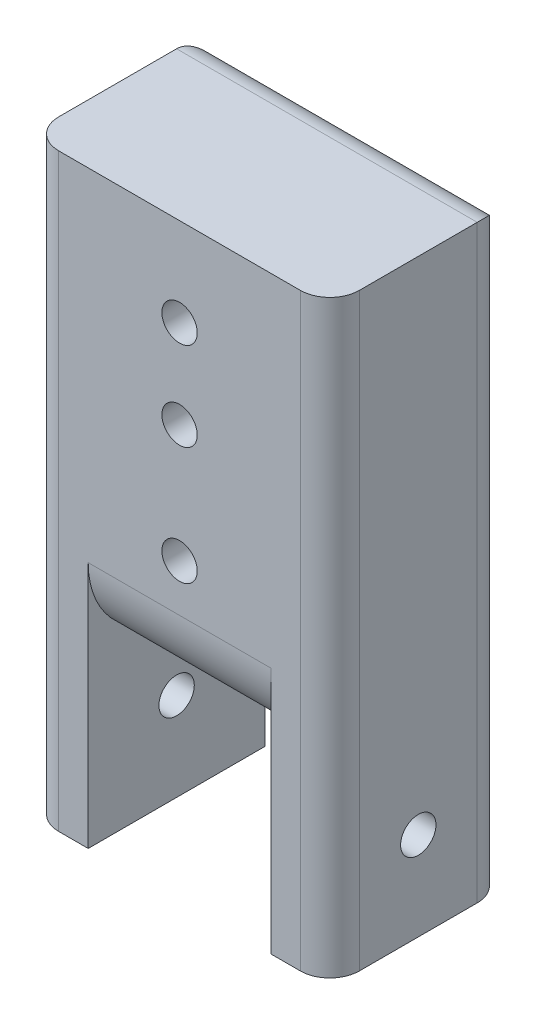
ISO-10303-21;
HEADER;
FILE_DESCRIPTION(('STEP AP214'),'2;1');
FILE_NAME('part.step','',(''),(''),'','','');
FILE_SCHEMA(('AUTOMOTIVE_DESIGN { 1 0 10303 214 1 1 1 1 }'));
ENDSEC;
DATA;
#1=APPLICATION_CONTEXT('core data for automotive mechanical design processes');
#2=APPLICATION_PROTOCOL_DEFINITION('international standard','automotive_design',2000,#1);
#3=PRODUCT_CONTEXT('',#1,'mechanical');
#4=PRODUCT('Part','Part','',(#3));
#5=PRODUCT_RELATED_PRODUCT_CATEGORY('part','',(#4));
#6=PRODUCT_DEFINITION_FORMATION('','',#4);
#7=PRODUCT_DEFINITION_CONTEXT('part definition',#1,'design');
#8=PRODUCT_DEFINITION('design','',#6,#7);
#9=PRODUCT_DEFINITION_SHAPE('','',#8);
#10=(LENGTH_UNIT() NAMED_UNIT(*) SI_UNIT(.MILLI.,.METRE.));
#11=(NAMED_UNIT(*) PLANE_ANGLE_UNIT() SI_UNIT($,.RADIAN.));
#12=(NAMED_UNIT(*) SI_UNIT($,.STERADIAN.) SOLID_ANGLE_UNIT());
#13=UNCERTAINTY_MEASURE_WITH_UNIT(LENGTH_MEASURE(1.E-05),#10,'distance_accuracy_value','');
#14=(GEOMETRIC_REPRESENTATION_CONTEXT(3) GLOBAL_UNCERTAINTY_ASSIGNED_CONTEXT((#13)) GLOBAL_UNIT_ASSIGNED_CONTEXT((#10,
#11,#12)) REPRESENTATION_CONTEXT('',''));
#15=CARTESIAN_POINT('',(0.,0.,0.));
#16=DIRECTION('',(0.,0.,1.));
#17=DIRECTION('',(1.,0.,0.));
#18=AXIS2_PLACEMENT_3D('',#15,#16,#17);
#19=CARTESIAN_POINT('',(0.,0.,30.));
#20=DIRECTION('',(1.,0.,0.));
#21=DIRECTION('',(0.,1.,0.));
#22=AXIS2_PLACEMENT_3D('',#19,#20,#21);
#23=PLANE('',#22);
#24=CARTESIAN_POINT('',(0.,-85.,15.));
#25=DIRECTION('',(1.,0.,0.));
#26=DIRECTION('',(0.,1.,0.));
#27=AXIS2_PLACEMENT_3D('',#24,#25,#26);
#28=CIRCLE('',#27,3.);
#29=CARTESIAN_POINT('',(0.,-82.,15.));
#30=VERTEX_POINT('',#29);
#31=EDGE_CURVE('E169',#30,#30,#28,.T.);
#32=ORIENTED_EDGE('',*,*,#31,.T.);
#33=EDGE_LOOP('',(#32));
#34=FACE_BOUND('',#33,.T.);
#35=DIRECTION('',(0.,0.,-1.));
#36=VECTOR('',#35,1.);
#37=CARTESIAN_POINT('',(0.,-100.,30.));
#38=LINE('',#37,#36);
#39=CARTESIAN_POINT('',(0.,-100.,25.));
#40=VERTEX_POINT('',#39);
#41=CARTESIAN_POINT('',(0.,-100.,5.));
#42=VERTEX_POINT('',#41);
#43=EDGE_CURVE('E149',#40,#42,#38,.T.);
#44=ORIENTED_EDGE('',*,*,#43,.F.);
#45=DIRECTION('',(0.,-1.,0.));
#46=VECTOR('',#45,1.);
#47=CARTESIAN_POINT('',(0.,0.,25.));
#48=LINE('',#47,#46);
#49=CARTESIAN_POINT('',(0.,0.,25.));
#50=VERTEX_POINT('',#49);
#51=EDGE_CURVE('E216',#40,#50,#48,.F.);
#52=ORIENTED_EDGE('',*,*,#51,.T.);
#53=DIRECTION('',(0.,0.,-1.));
#54=VECTOR('',#53,1.);
#55=CARTESIAN_POINT('',(0.,0.,30.));
#56=LINE('',#55,#54);
#57=CARTESIAN_POINT('',(0.,0.,5.));
#58=VERTEX_POINT('',#57);
#59=EDGE_CURVE('E166',#50,#58,#56,.T.);
#60=ORIENTED_EDGE('',*,*,#59,.T.);
#61=DIRECTION('',(0.,-1.,0.));
#62=VECTOR('',#61,1.);
#63=CARTESIAN_POINT('',(0.,0.,5.));
#64=LINE('',#63,#62);
#65=EDGE_CURVE('E192',#58,#42,#64,.T.);
#66=ORIENTED_EDGE('',*,*,#65,.T.);
#67=EDGE_LOOP('',(#44,#52,#60,#66));
#68=FACE_BOUND('',#67,.T.);
#69=ADVANCED_FACE('F35',(#34,#68),#23,.F.);
#70=CARTESIAN_POINT('',(0.,-100.,30.));
#71=DIRECTION('',(0.,1.,0.));
#72=DIRECTION('',(0.,0.,1.));
#73=AXIS2_PLACEMENT_3D('',#70,#71,#72);
#74=PLANE('',#73);
#75=DIRECTION('',(1.,0.,0.));
#76=VECTOR('',#75,1.);
#77=CARTESIAN_POINT('',(0.,-100.,30.));
#78=LINE('',#77,#76);
#79=CARTESIAN_POINT('',(5.00000000000001,-100.,30.));
#80=VERTEX_POINT('',#79);
#81=CARTESIAN_POINT('',(10.,-100.,30.));
#82=VERTEX_POINT('',#81);
#83=EDGE_CURVE('E131',#80,#82,#78,.T.);
#84=ORIENTED_EDGE('',*,*,#83,.F.);
#85=CARTESIAN_POINT('',(5.00000000000001,-100.,25.));
#86=DIRECTION('',(0.,1.,0.));
#87=DIRECTION('',(0.,0.,1.));
#88=AXIS2_PLACEMENT_3D('',#85,#86,#87);
#89=CIRCLE('',#88,5.);
#90=EDGE_CURVE('E214',#80,#40,#89,.F.);
#91=ORIENTED_EDGE('',*,*,#90,.T.);
#92=ORIENTED_EDGE('',*,*,#43,.T.);
#93=CARTESIAN_POINT('',(5.00000000000001,-100.,5.));
#94=DIRECTION('',(0.,1.,0.));
#95=DIRECTION('',(0.,0.,1.));
#96=AXIS2_PLACEMENT_3D('',#93,#94,#95);
#97=CIRCLE('',#96,5.);
#98=CARTESIAN_POINT('',(5.00000000000001,-100.,0.));
#99=VERTEX_POINT('',#98);
#100=EDGE_CURVE('E195',#42,#99,#97,.F.);
#101=ORIENTED_EDGE('',*,*,#100,.T.);
#102=DIRECTION('',(1.,0.,0.));
#103=VECTOR('',#102,1.);
#104=CARTESIAN_POINT('',(0.,-100.,0.));
#105=LINE('',#104,#103);
#106=CARTESIAN_POINT('',(10.,-100.,0.));
#107=VERTEX_POINT('',#106);
#108=EDGE_CURVE('E147',#99,#107,#105,.T.);
#109=ORIENTED_EDGE('',*,*,#108,.T.);
#110=DIRECTION('',(0.,0.,-1.));
#111=VECTOR('',#110,1.);
#112=CARTESIAN_POINT('',(10.,-100.,30.));
#113=LINE('',#112,#111);
#114=EDGE_CURVE('E144',#82,#107,#113,.T.);
#115=ORIENTED_EDGE('',*,*,#114,.F.);
#116=EDGE_LOOP('',(#84,#91,#92,#101,#109,#115));
#117=FACE_BOUND('',#116,.T.);
#118=ADVANCED_FACE('F145',(#117),#74,.F.);
#119=CARTESIAN_POINT('',(10.,-73.,30.));
#120=DIRECTION('',(-1.,0.,0.));
#121=DIRECTION('',(0.,-1.,0.));
#122=AXIS2_PLACEMENT_3D('',#119,#120,#121);
#123=PLANE('',#122);
#124=CARTESIAN_POINT('',(10.,-85.,15.));
#125=DIRECTION('',(-1.,0.,0.));
#126=DIRECTION('',(0.,-1.,0.));
#127=AXIS2_PLACEMENT_3D('',#124,#125,#126);
#128=CIRCLE('',#127,3.);
#129=CARTESIAN_POINT('',(10.,-88.,15.));
#130=VERTEX_POINT('',#129);
#131=EDGE_CURVE('E361',#130,#130,#128,.T.);
#132=ORIENTED_EDGE('',*,*,#131,.T.);
#133=EDGE_LOOP('',(#132));
#134=FACE_BOUND('',#133,.T.);
#135=DIRECTION('',(0.,1.,0.));
#136=VECTOR('',#135,1.);
#137=CARTESIAN_POINT('',(10.,-73.,0.));
#138=LINE('',#137,#136);
#139=CARTESIAN_POINT('',(10.,-58.,0.));
#140=VERTEX_POINT('',#139);
#141=EDGE_CURVE('E168',#107,#140,#138,.T.);
#142=ORIENTED_EDGE('',*,*,#141,.T.);
#143=CARTESIAN_POINT('',(10.,-58.,15.));
#144=DIRECTION('',(-1.,0.,0.));
#145=DIRECTION('',(0.,-1.,0.));
#146=AXIS2_PLACEMENT_3D('',#143,#144,#145);
#147=CIRCLE('',#146,15.);
#148=CARTESIAN_POINT('',(10.,-73.,15.));
#149=VERTEX_POINT('',#148);
#150=EDGE_CURVE('E11',#140,#149,#147,.T.);
#151=ORIENTED_EDGE('',*,*,#150,.T.);
#152=CARTESIAN_POINT('',(10.,-58.,15.));
#153=DIRECTION('',(-1.,0.,0.));
#154=DIRECTION('',(0.,-1.,0.));
#155=AXIS2_PLACEMENT_3D('',#152,#153,#154);
#156=CIRCLE('',#155,15.);
#157=CARTESIAN_POINT('',(10.,-58.,30.));
#158=VERTEX_POINT('',#157);
#159=EDGE_CURVE('E154',#149,#158,#156,.T.);
#160=ORIENTED_EDGE('',*,*,#159,.T.);
#161=DIRECTION('',(0.,1.,0.));
#162=VECTOR('',#161,1.);
#163=CARTESIAN_POINT('',(10.,-73.,30.));
#164=LINE('',#163,#162);
#165=EDGE_CURVE('E136',#82,#158,#164,.T.);
#166=ORIENTED_EDGE('',*,*,#165,.F.);
#167=ORIENTED_EDGE('',*,*,#114,.T.);
#168=EDGE_LOOP('',(#142,#151,#160,#166,#167));
#169=FACE_BOUND('',#168,.T.);
#170=ADVANCED_FACE('F152',(#134,#169),#123,.F.);
#171=CARTESIAN_POINT('',(41.,-100.,30.));
#172=DIRECTION('',(1.,0.,0.));
#173=DIRECTION('',(0.,1.,0.));
#174=AXIS2_PLACEMENT_3D('',#171,#172,#173);
#175=PLANE('',#174);
#176=CARTESIAN_POINT('',(41.,-85.,15.));
#177=DIRECTION('',(1.,0.,0.));
#178=DIRECTION('',(0.,1.,0.));
#179=AXIS2_PLACEMENT_3D('',#176,#177,#178);
#180=CIRCLE('',#179,3.);
#181=CARTESIAN_POINT('',(41.,-82.,15.));
#182=VERTEX_POINT('',#181);
#183=EDGE_CURVE('E358',#182,#182,#180,.T.);
#184=ORIENTED_EDGE('',*,*,#183,.T.);
#185=EDGE_LOOP('',(#184));
#186=FACE_BOUND('',#185,.T.);
#187=DIRECTION('',(0.,-1.,0.));
#188=VECTOR('',#187,1.);
#189=CARTESIAN_POINT('',(41.,-100.,0.));
#190=LINE('',#189,#188);
#191=CARTESIAN_POINT('',(41.,-58.,0.));
#192=VERTEX_POINT('',#191);
#193=CARTESIAN_POINT('',(41.,-100.,0.));
#194=VERTEX_POINT('',#193);
#195=EDGE_CURVE('E171',#192,#194,#190,.T.);
#196=ORIENTED_EDGE('',*,*,#195,.T.);
#197=DIRECTION('',(0.,0.,-1.));
#198=VECTOR('',#197,1.);
#199=CARTESIAN_POINT('',(41.,-100.,30.));
#200=LINE('',#199,#198);
#201=CARTESIAN_POINT('',(41.,-100.,30.));
#202=VERTEX_POINT('',#201);
#203=EDGE_CURVE('E150',#202,#194,#200,.T.);
#204=ORIENTED_EDGE('',*,*,#203,.F.);
#205=DIRECTION('',(0.,-1.,0.));
#206=VECTOR('',#205,1.);
#207=CARTESIAN_POINT('',(41.,-100.,30.));
#208=LINE('',#207,#206);
#209=CARTESIAN_POINT('',(41.,-58.,30.));
#210=VERTEX_POINT('',#209);
#211=EDGE_CURVE('E156',#210,#202,#208,.T.);
#212=ORIENTED_EDGE('',*,*,#211,.F.);
#213=CARTESIAN_POINT('',(41.,-58.,15.));
#214=DIRECTION('',(1.,0.,0.));
#215=DIRECTION('',(0.,1.,0.));
#216=AXIS2_PLACEMENT_3D('',#213,#214,#215);
#217=CIRCLE('',#216,15.);
#218=CARTESIAN_POINT('',(41.,-73.,15.));
#219=VERTEX_POINT('',#218);
#220=EDGE_CURVE('E57',#210,#219,#217,.T.);
#221=ORIENTED_EDGE('',*,*,#220,.T.);
#222=CARTESIAN_POINT('',(41.,-58.,15.));
#223=DIRECTION('',(1.,0.,0.));
#224=DIRECTION('',(0.,1.,0.));
#225=AXIS2_PLACEMENT_3D('',#222,#223,#224);
#226=CIRCLE('',#225,15.);
#227=EDGE_CURVE('E44',#219,#192,#226,.T.);
#228=ORIENTED_EDGE('',*,*,#227,.T.);
#229=EDGE_LOOP('',(#196,#204,#212,#221,#228));
#230=FACE_BOUND('',#229,.T.);
#231=ADVANCED_FACE('F234',(#186,#230),#175,.F.);
#232=CARTESIAN_POINT('',(51.,-100.,30.));
#233=DIRECTION('',(0.,1.,0.));
#234=DIRECTION('',(-1.,0.,0.));
#235=AXIS2_PLACEMENT_3D('',#232,#233,#234);
#236=PLANE('',#235);
#237=DIRECTION('',(0.,0.,-1.));
#238=VECTOR('',#237,1.);
#239=CARTESIAN_POINT('',(51.,-100.,30.));
#240=LINE('',#239,#238);
#241=CARTESIAN_POINT('',(51.,-100.,25.));
#242=VERTEX_POINT('',#241);
#243=CARTESIAN_POINT('',(51.,-100.,5.));
#244=VERTEX_POINT('',#243);
#245=EDGE_CURVE('E178',#242,#244,#240,.T.);
#246=ORIENTED_EDGE('',*,*,#245,.F.);
#247=CARTESIAN_POINT('',(46.,-100.,25.));
#248=DIRECTION('',(0.,1.,0.));
#249=DIRECTION('',(-1.,0.,0.));
#250=AXIS2_PLACEMENT_3D('',#247,#248,#249);
#251=CIRCLE('',#250,5.);
#252=CARTESIAN_POINT('',(46.,-100.,30.));
#253=VERTEX_POINT('',#252);
#254=EDGE_CURVE('E224',#242,#253,#251,.F.);
#255=ORIENTED_EDGE('',*,*,#254,.T.);
#256=DIRECTION('',(1.,0.,0.));
#257=VECTOR('',#256,1.);
#258=CARTESIAN_POINT('',(51.,-100.,30.));
#259=LINE('',#258,#257);
#260=EDGE_CURVE('E158',#202,#253,#259,.T.);
#261=ORIENTED_EDGE('',*,*,#260,.F.);
#262=ORIENTED_EDGE('',*,*,#203,.T.);
#263=DIRECTION('',(1.,0.,0.));
#264=VECTOR('',#263,1.);
#265=CARTESIAN_POINT('',(51.,-100.,0.));
#266=LINE('',#265,#264);
#267=CARTESIAN_POINT('',(46.,-100.,0.));
#268=VERTEX_POINT('',#267);
#269=EDGE_CURVE('E141',#194,#268,#266,.T.);
#270=ORIENTED_EDGE('',*,*,#269,.T.);
#271=CARTESIAN_POINT('',(46.,-100.,5.));
#272=DIRECTION('',(0.,1.,0.));
#273=DIRECTION('',(-1.,0.,0.));
#274=AXIS2_PLACEMENT_3D('',#271,#272,#273);
#275=CIRCLE('',#274,5.);
#276=EDGE_CURVE('E200',#268,#244,#275,.F.);
#277=ORIENTED_EDGE('',*,*,#276,.T.);
#278=EDGE_LOOP('',(#246,#255,#261,#262,#270,#277));
#279=FACE_BOUND('',#278,.T.);
#280=ADVANCED_FACE('F245',(#279),#236,.F.);
#281=CARTESIAN_POINT('',(51.,0.,30.));
#282=DIRECTION('',(-1.,0.,0.));
#283=DIRECTION('',(0.,-1.,0.));
#284=AXIS2_PLACEMENT_3D('',#281,#282,#283);
#285=PLANE('',#284);
#286=CARTESIAN_POINT('',(51.,-85.,15.));
#287=DIRECTION('',(1.,0.,0.));
#288=DIRECTION('',(0.,1.,0.));
#289=AXIS2_PLACEMENT_3D('',#286,#287,#288);
#290=CIRCLE('',#289,3.);
#291=CARTESIAN_POINT('',(51.,-82.,15.));
#292=VERTEX_POINT('',#291);
#293=EDGE_CURVE('E355',#292,#292,#290,.T.);
#294=ORIENTED_EDGE('',*,*,#293,.F.);
#295=EDGE_LOOP('',(#294));
#296=FACE_BOUND('',#295,.T.);
#297=DIRECTION('',(0.,0.,-1.));
#298=VECTOR('',#297,1.);
#299=CARTESIAN_POINT('',(51.,0.,30.));
#300=LINE('',#299,#298);
#301=CARTESIAN_POINT('',(51.,0.,25.));
#302=VERTEX_POINT('',#301);
#303=CARTESIAN_POINT('',(51.,0.,5.));
#304=VERTEX_POINT('',#303);
#305=EDGE_CURVE('E176',#302,#304,#300,.T.);
#306=ORIENTED_EDGE('',*,*,#305,.F.);
#307=DIRECTION('',(0.,1.,0.));
#308=VECTOR('',#307,1.);
#309=CARTESIAN_POINT('',(51.,-100.,25.));
#310=LINE('',#309,#308);
#311=EDGE_CURVE('E222',#302,#242,#310,.F.);
#312=ORIENTED_EDGE('',*,*,#311,.T.);
#313=ORIENTED_EDGE('',*,*,#245,.T.);
#314=DIRECTION('',(0.,1.,0.));
#315=VECTOR('',#314,1.);
#316=CARTESIAN_POINT('',(51.,0.,5.));
#317=LINE('',#316,#315);
#318=EDGE_CURVE('E197',#244,#304,#317,.T.);
#319=ORIENTED_EDGE('',*,*,#318,.T.);
#320=EDGE_LOOP('',(#306,#312,#313,#319));
#321=FACE_BOUND('',#320,.T.);
#322=ADVANCED_FACE('F254',(#296,#321),#285,.F.);
#323=CARTESIAN_POINT('',(0.,0.,30.));
#324=DIRECTION('',(0.,-1.,0.));
#325=DIRECTION('',(0.,0.,-1.));
#326=AXIS2_PLACEMENT_3D('',#323,#324,#325);
#327=PLANE('',#326);
#328=ORIENTED_EDGE('',*,*,#59,.F.);
#329=CARTESIAN_POINT('',(5.,0.,25.));
#330=DIRECTION('',(0.,-1.,0.));
#331=DIRECTION('',(0.,0.,-1.));
#332=AXIS2_PLACEMENT_3D('',#329,#330,#331);
#333=CIRCLE('',#332,5.);
#334=CARTESIAN_POINT('',(5.,0.,30.));
#335=VERTEX_POINT('',#334);
#336=EDGE_CURVE('E220',#50,#335,#333,.F.);
#337=ORIENTED_EDGE('',*,*,#336,.T.);
#338=DIRECTION('',(-1.,0.,0.));
#339=VECTOR('',#338,1.);
#340=CARTESIAN_POINT('',(0.,0.,30.));
#341=LINE('',#340,#339);
#342=CARTESIAN_POINT('',(46.,0.,30.));
#343=VERTEX_POINT('',#342);
#344=EDGE_CURVE('E164',#343,#335,#341,.T.);
#345=ORIENTED_EDGE('',*,*,#344,.F.);
#346=CARTESIAN_POINT('',(46.,0.,25.));
#347=DIRECTION('',(0.,-1.,0.));
#348=DIRECTION('',(0.,0.,-1.));
#349=AXIS2_PLACEMENT_3D('',#346,#347,#348);
#350=CIRCLE('',#349,5.);
#351=EDGE_CURVE('E218',#343,#302,#350,.F.);
#352=ORIENTED_EDGE('',*,*,#351,.T.);
#353=ORIENTED_EDGE('',*,*,#305,.T.);
#354=DIRECTION('',(-1.,0.,0.));
#355=VECTOR('',#354,1.);
#356=CARTESIAN_POINT('',(0.,0.,5.));
#357=LINE('',#356,#355);
#358=EDGE_CURVE('E183',#304,#58,#357,.T.);
#359=ORIENTED_EDGE('',*,*,#358,.T.);
#360=EDGE_LOOP('',(#328,#337,#345,#352,#353,#359));
#361=FACE_BOUND('',#360,.T.);
#362=ADVANCED_FACE('F263',(#361),#327,.F.);
#363=CARTESIAN_POINT('',(0.,0.,30.));
#364=DIRECTION('',(0.,0.,1.));
#365=DIRECTION('',(1.,0.,0.));
#366=AXIS2_PLACEMENT_3D('',#363,#364,#365);
#367=PLANE('',#366);
#368=CARTESIAN_POINT('',(25.5,-50.,30.));
#369=DIRECTION('',(0.,0.,1.));
#370=DIRECTION('',(1.,0.,0.));
#371=AXIS2_PLACEMENT_3D('',#368,#369,#370);
#372=CIRCLE('',#371,3.);
#373=CARTESIAN_POINT('',(28.5,-50.,30.));
#374=VERTEX_POINT('',#373);
#375=EDGE_CURVE('E352',#374,#374,#372,.T.);
#376=ORIENTED_EDGE('',*,*,#375,.F.);
#377=EDGE_LOOP('',(#376));
#378=FACE_BOUND('',#377,.T.);
#379=CARTESIAN_POINT('',(25.5,-15.,30.));
#380=DIRECTION('',(0.,0.,1.));
#381=DIRECTION('',(1.,0.,0.));
#382=AXIS2_PLACEMENT_3D('',#379,#380,#381);
#383=CIRCLE('',#382,3.);
#384=CARTESIAN_POINT('',(28.5,-15.,30.));
#385=VERTEX_POINT('',#384);
#386=EDGE_CURVE('E336',#385,#385,#383,.T.);
#387=ORIENTED_EDGE('',*,*,#386,.F.);
#388=EDGE_LOOP('',(#387));
#389=FACE_BOUND('',#388,.T.);
#390=CARTESIAN_POINT('',(25.5,-30.,30.));
#391=DIRECTION('',(0.,0.,1.));
#392=DIRECTION('',(1.,0.,0.));
#393=AXIS2_PLACEMENT_3D('',#390,#391,#392);
#394=CIRCLE('',#393,3.);
#395=CARTESIAN_POINT('',(28.5,-30.,30.));
#396=VERTEX_POINT('',#395);
#397=EDGE_CURVE('E344',#396,#396,#394,.T.);
#398=ORIENTED_EDGE('',*,*,#397,.F.);
#399=EDGE_LOOP('',(#398));
#400=FACE_BOUND('',#399,.T.);
#401=DIRECTION('',(1.,0.,0.));
#402=VECTOR('',#401,1.);
#403=CARTESIAN_POINT('',(41.,-58.,30.));
#404=LINE('',#403,#402);
#405=EDGE_CURVE('E226',#158,#210,#404,.T.);
#406=ORIENTED_EDGE('',*,*,#405,.T.);
#407=ORIENTED_EDGE('',*,*,#211,.T.);
#408=ORIENTED_EDGE('',*,*,#260,.T.);
#409=DIRECTION('',(0.,1.,0.));
#410=VECTOR('',#409,1.);
#411=CARTESIAN_POINT('',(46.,0.,30.));
#412=LINE('',#411,#410);
#413=EDGE_CURVE('E203',#253,#343,#412,.T.);
#414=ORIENTED_EDGE('',*,*,#413,.T.);
#415=ORIENTED_EDGE('',*,*,#344,.T.);
#416=DIRECTION('',(0.,-1.,0.));
#417=VECTOR('',#416,1.);
#418=CARTESIAN_POINT('',(5.00000000000001,-100.,30.));
#419=LINE('',#418,#417);
#420=EDGE_CURVE('E139',#335,#80,#419,.T.);
#421=ORIENTED_EDGE('',*,*,#420,.T.);
#422=ORIENTED_EDGE('',*,*,#83,.T.);
#423=ORIENTED_EDGE('',*,*,#165,.T.);
#424=EDGE_LOOP('',(#406,#407,#408,#414,#415,#421,#422,#423));
#425=FACE_BOUND('',#424,.T.);
#426=ADVANCED_FACE('F134',(#378,#389,#400,#425),#367,.T.);
#427=CARTESIAN_POINT('',(0.,0.,0.));
#428=DIRECTION('',(0.,0.,1.));
#429=DIRECTION('',(1.,0.,0.));
#430=AXIS2_PLACEMENT_3D('',#427,#428,#429);
#431=PLANE('',#430);
#432=CARTESIAN_POINT('',(25.5,-50.,0.));
#433=DIRECTION('',(0.,0.,-1.));
#434=DIRECTION('',(-1.,0.,0.));
#435=AXIS2_PLACEMENT_3D('',#432,#433,#434);
#436=CIRCLE('',#435,3.);
#437=CARTESIAN_POINT('',(22.5,-50.,0.));
#438=VERTEX_POINT('',#437);
#439=EDGE_CURVE('E210',#438,#438,#436,.T.);
#440=ORIENTED_EDGE('',*,*,#439,.F.);
#441=EDGE_LOOP('',(#440));
#442=FACE_BOUND('',#441,.T.);
#443=CARTESIAN_POINT('',(25.5,-15.,0.));
#444=DIRECTION('',(0.,0.,-1.));
#445=DIRECTION('',(-1.,0.,0.));
#446=AXIS2_PLACEMENT_3D('',#443,#444,#445);
#447=CIRCLE('',#446,3.);
#448=CARTESIAN_POINT('',(22.5,-15.,0.));
#449=VERTEX_POINT('',#448);
#450=EDGE_CURVE('E339',#449,#449,#447,.T.);
#451=ORIENTED_EDGE('',*,*,#450,.F.);
#452=EDGE_LOOP('',(#451));
#453=FACE_BOUND('',#452,.T.);
#454=CARTESIAN_POINT('',(25.5,-30.,0.));
#455=DIRECTION('',(0.,0.,-1.));
#456=DIRECTION('',(-1.,0.,0.));
#457=AXIS2_PLACEMENT_3D('',#454,#455,#456);
#458=CIRCLE('',#457,3.);
#459=CARTESIAN_POINT('',(22.5,-30.,0.));
#460=VERTEX_POINT('',#459);
#461=EDGE_CURVE('E341',#460,#460,#458,.T.);
#462=ORIENTED_EDGE('',*,*,#461,.F.);
#463=EDGE_LOOP('',(#462));
#464=FACE_BOUND('',#463,.T.);
#465=ORIENTED_EDGE('',*,*,#195,.F.);
#466=DIRECTION('',(1.,0.,0.));
#467=VECTOR('',#466,1.);
#468=CARTESIAN_POINT('',(0.,-58.,0.));
#469=LINE('',#468,#467);
#470=EDGE_CURVE('E228',#192,#140,#469,.F.);
#471=ORIENTED_EDGE('',*,*,#470,.T.);
#472=ORIENTED_EDGE('',*,*,#141,.F.);
#473=ORIENTED_EDGE('',*,*,#108,.F.);
#474=DIRECTION('',(0.,-1.,0.));
#475=VECTOR('',#474,1.);
#476=CARTESIAN_POINT('',(5.,0.,0.));
#477=LINE('',#476,#475);
#478=CARTESIAN_POINT('',(5.,-5.,0.));
#479=VERTEX_POINT('',#478);
#480=EDGE_CURVE('E190',#99,#479,#477,.F.);
#481=ORIENTED_EDGE('',*,*,#480,.T.);
#482=DIRECTION('',(-1.,0.,0.));
#483=VECTOR('',#482,1.);
#484=CARTESIAN_POINT('',(0.,-5.,0.));
#485=LINE('',#484,#483);
#486=CARTESIAN_POINT('',(46.,-5.,0.));
#487=VERTEX_POINT('',#486);
#488=EDGE_CURVE('E188',#479,#487,#485,.F.);
#489=ORIENTED_EDGE('',*,*,#488,.T.);
#490=DIRECTION('',(0.,1.,0.));
#491=VECTOR('',#490,1.);
#492=CARTESIAN_POINT('',(46.,0.,0.));
#493=LINE('',#492,#491);
#494=EDGE_CURVE('E186',#487,#268,#493,.F.);
#495=ORIENTED_EDGE('',*,*,#494,.T.);
#496=ORIENTED_EDGE('',*,*,#269,.F.);
#497=EDGE_LOOP('',(#465,#471,#472,#473,#481,#489,#495,#496));
#498=FACE_BOUND('',#497,.T.);
#499=ADVANCED_FACE('F239',(#442,#453,#464,#498),#431,.F.);
#500=CARTESIAN_POINT('',(-60.,-85.,15.));
#501=DIRECTION('',(1.,0.,0.));
#502=DIRECTION('',(0.,1.,0.));
#503=AXIS2_PLACEMENT_3D('',#500,#501,#502);
#504=CYLINDRICAL_SURFACE('',#503,3.);
#505=ORIENTED_EDGE('',*,*,#293,.T.);
#506=EDGE_LOOP('',(#505));
#507=FACE_BOUND('',#506,.T.);
#508=ORIENTED_EDGE('',*,*,#183,.F.);
#509=EDGE_LOOP('',(#508));
#510=FACE_BOUND('',#509,.T.);
#511=ADVANCED_FACE('F311',(#507,#510),#504,.F.);
#512=ORIENTED_EDGE('',*,*,#131,.F.);
#513=EDGE_LOOP('',(#512));
#514=FACE_BOUND('',#513,.T.);
#515=ORIENTED_EDGE('',*,*,#31,.F.);
#516=EDGE_LOOP('',(#515));
#517=FACE_BOUND('',#516,.T.);
#518=ADVANCED_FACE('F316',(#514,#517),#504,.F.);
#519=CARTESIAN_POINT('',(25.5,-30.,111.));
#520=DIRECTION('',(0.,0.,-1.));
#521=DIRECTION('',(-1.,0.,0.));
#522=AXIS2_PLACEMENT_3D('',#519,#520,#521);
#523=CYLINDRICAL_SURFACE('',#522,3.);
#524=ORIENTED_EDGE('',*,*,#397,.T.);
#525=EDGE_LOOP('',(#524));
#526=FACE_BOUND('',#525,.T.);
#527=ORIENTED_EDGE('',*,*,#461,.T.);
#528=EDGE_LOOP('',(#527));
#529=FACE_BOUND('',#528,.T.);
#530=ADVANCED_FACE('F319',(#526,#529),#523,.F.);
#531=CARTESIAN_POINT('',(25.5,-15.,111.));
#532=DIRECTION('',(0.,0.,-1.));
#533=DIRECTION('',(-1.,0.,0.));
#534=AXIS2_PLACEMENT_3D('',#531,#532,#533);
#535=CYLINDRICAL_SURFACE('',#534,3.);
#536=ORIENTED_EDGE('',*,*,#386,.T.);
#537=EDGE_LOOP('',(#536));
#538=FACE_BOUND('',#537,.T.);
#539=ORIENTED_EDGE('',*,*,#450,.T.);
#540=EDGE_LOOP('',(#539));
#541=FACE_BOUND('',#540,.T.);
#542=ADVANCED_FACE('F323',(#538,#541),#535,.F.);
#543=CARTESIAN_POINT('',(25.5,-50.,111.));
#544=DIRECTION('',(0.,0.,-1.));
#545=DIRECTION('',(-1.,0.,0.));
#546=AXIS2_PLACEMENT_3D('',#543,#544,#545);
#547=CYLINDRICAL_SURFACE('',#546,3.);
#548=ORIENTED_EDGE('',*,*,#375,.T.);
#549=EDGE_LOOP('',(#548));
#550=FACE_BOUND('',#549,.T.);
#551=ORIENTED_EDGE('',*,*,#439,.T.);
#552=EDGE_LOOP('',(#551));
#553=FACE_BOUND('',#552,.T.);
#554=ADVANCED_FACE('F325',(#550,#553),#547,.F.);
#555=CARTESIAN_POINT('',(46.,0.,5.));
#556=DIRECTION('',(0.,1.,0.));
#557=DIRECTION('',(-1.,0.,0.));
#558=AXIS2_PLACEMENT_3D('',#555,#556,#557);
#559=CYLINDRICAL_SURFACE('',#558,5.);
#560=ORIENTED_EDGE('',*,*,#276,.F.);
#561=ORIENTED_EDGE('',*,*,#494,.F.);
#562=CARTESIAN_POINT('',(46.,-5.,5.));
#563=DIRECTION('',(-0.707106781186547,0.707106781186547,0.));
#564=DIRECTION('',(0.707106781186547,0.707106781186548,0.));
#565=AXIS2_PLACEMENT_3D('',#562,#563,#564);
#566=ELLIPSE('',#565,7.07106781186547,5.);
#567=EDGE_CURVE('E207',#304,#487,#566,.T.);
#568=ORIENTED_EDGE('',*,*,#567,.F.);
#569=ORIENTED_EDGE('',*,*,#318,.F.);
#570=EDGE_LOOP('',(#560,#561,#568,#569));
#571=FACE_BOUND('',#570,.T.);
#572=ADVANCED_FACE('F249',(#571),#559,.T.);
#573=CARTESIAN_POINT('',(5.,0.,5.));
#574=DIRECTION('',(0.,-1.,0.));
#575=DIRECTION('',(1.,0.,0.));
#576=AXIS2_PLACEMENT_3D('',#573,#574,#575);
#577=CYLINDRICAL_SURFACE('',#576,5.);
#578=ORIENTED_EDGE('',*,*,#100,.F.);
#579=ORIENTED_EDGE('',*,*,#65,.F.);
#580=CARTESIAN_POINT('',(5.,-5.,5.));
#581=DIRECTION('',(-0.707106781186547,-0.707106781186548,0.));
#582=DIRECTION('',(0.707106781186548,-0.707106781186547,0.));
#583=AXIS2_PLACEMENT_3D('',#580,#581,#582);
#584=ELLIPSE('',#583,7.07106781186548,5.);
#585=EDGE_CURVE('E204',#479,#58,#584,.F.);
#586=ORIENTED_EDGE('',*,*,#585,.F.);
#587=ORIENTED_EDGE('',*,*,#480,.F.);
#588=EDGE_LOOP('',(#578,#579,#586,#587));
#589=FACE_BOUND('',#588,.T.);
#590=ADVANCED_FACE('F275',(#589),#577,.T.);
#591=CARTESIAN_POINT('',(0.,-5.,5.));
#592=DIRECTION('',(-1.,0.,0.));
#593=DIRECTION('',(0.,0.,1.));
#594=AXIS2_PLACEMENT_3D('',#591,#592,#593);
#595=CYLINDRICAL_SURFACE('',#594,5.);
#596=ORIENTED_EDGE('',*,*,#567,.T.);
#597=ORIENTED_EDGE('',*,*,#488,.F.);
#598=ORIENTED_EDGE('',*,*,#585,.T.);
#599=ORIENTED_EDGE('',*,*,#358,.F.);
#600=EDGE_LOOP('',(#596,#597,#598,#599));
#601=FACE_BOUND('',#600,.T.);
#602=ADVANCED_FACE('F278',(#601),#595,.T.);
#603=CARTESIAN_POINT('',(5.,0.,25.));
#604=DIRECTION('',(0.,1.,0.));
#605=DIRECTION('',(-1.,0.,0.));
#606=AXIS2_PLACEMENT_3D('',#603,#604,#605);
#607=CYLINDRICAL_SURFACE('',#606,5.);
#608=ORIENTED_EDGE('',*,*,#336,.F.);
#609=ORIENTED_EDGE('',*,*,#51,.F.);
#610=ORIENTED_EDGE('',*,*,#90,.F.);
#611=ORIENTED_EDGE('',*,*,#420,.F.);
#612=EDGE_LOOP('',(#608,#609,#610,#611));
#613=FACE_BOUND('',#612,.T.);
#614=ADVANCED_FACE('F267',(#613),#607,.T.);
#615=CARTESIAN_POINT('',(46.,0.,25.));
#616=DIRECTION('',(0.,-1.,0.));
#617=DIRECTION('',(1.,0.,0.));
#618=AXIS2_PLACEMENT_3D('',#615,#616,#617);
#619=CYLINDRICAL_SURFACE('',#618,5.);
#620=ORIENTED_EDGE('',*,*,#254,.F.);
#621=ORIENTED_EDGE('',*,*,#311,.F.);
#622=ORIENTED_EDGE('',*,*,#351,.F.);
#623=ORIENTED_EDGE('',*,*,#413,.F.);
#624=EDGE_LOOP('',(#620,#621,#622,#623));
#625=FACE_BOUND('',#624,.T.);
#626=ADVANCED_FACE('F259',(#625),#619,.T.);
#627=CARTESIAN_POINT('',(41.,-58.,15.));
#628=DIRECTION('',(1.,0.,0.));
#629=DIRECTION('',(0.,0.,-1.));
#630=AXIS2_PLACEMENT_3D('',#627,#628,#629);
#631=CYLINDRICAL_SURFACE('',#630,15.);
#632=DIRECTION('',(1.,0.,0.));
#633=VECTOR('',#632,1.);
#634=CARTESIAN_POINT('',(41.,-73.,15.));
#635=LINE('',#634,#633);
#636=EDGE_CURVE('E39',#149,#219,#635,.T.);
#637=ORIENTED_EDGE('',*,*,#636,.F.);
#638=ORIENTED_EDGE('',*,*,#150,.F.);
#639=ORIENTED_EDGE('',*,*,#470,.F.);
#640=ORIENTED_EDGE('',*,*,#227,.F.);
#641=EDGE_LOOP('',(#637,#638,#639,#640));
#642=FACE_BOUND('',#641,.T.);
#643=ADVANCED_FACE('F37',(#642),#631,.T.);
#644=CARTESIAN_POINT('',(0.,-58.,15.));
#645=DIRECTION('',(-1.,0.,0.));
#646=DIRECTION('',(0.,0.,1.));
#647=AXIS2_PLACEMENT_3D('',#644,#645,#646);
#648=CYLINDRICAL_SURFACE('',#647,15.);
#649=ORIENTED_EDGE('',*,*,#159,.F.);
#650=ORIENTED_EDGE('',*,*,#636,.T.);
#651=ORIENTED_EDGE('',*,*,#220,.F.);
#652=ORIENTED_EDGE('',*,*,#405,.F.);
#653=EDGE_LOOP('',(#649,#650,#651,#652));
#654=FACE_BOUND('',#653,.T.);
#655=ADVANCED_FACE('F484',(#654),#648,.T.);
#656=CLOSED_SHELL('',(#69,#118,#170,#231,#280,#322,#362,#426,#499,#511,#518,#530,#542,#554,#572,
#590,#602,#614,#626,#643,#655));
#657=MANIFOLD_SOLID_BREP('B2',#656);
#658=ADVANCED_BREP_SHAPE_REPRESENTATION('',(#18,#657),#14);
#659=SHAPE_DEFINITION_REPRESENTATION(#9,#658);
ENDSEC;
END-ISO-10303-21;
